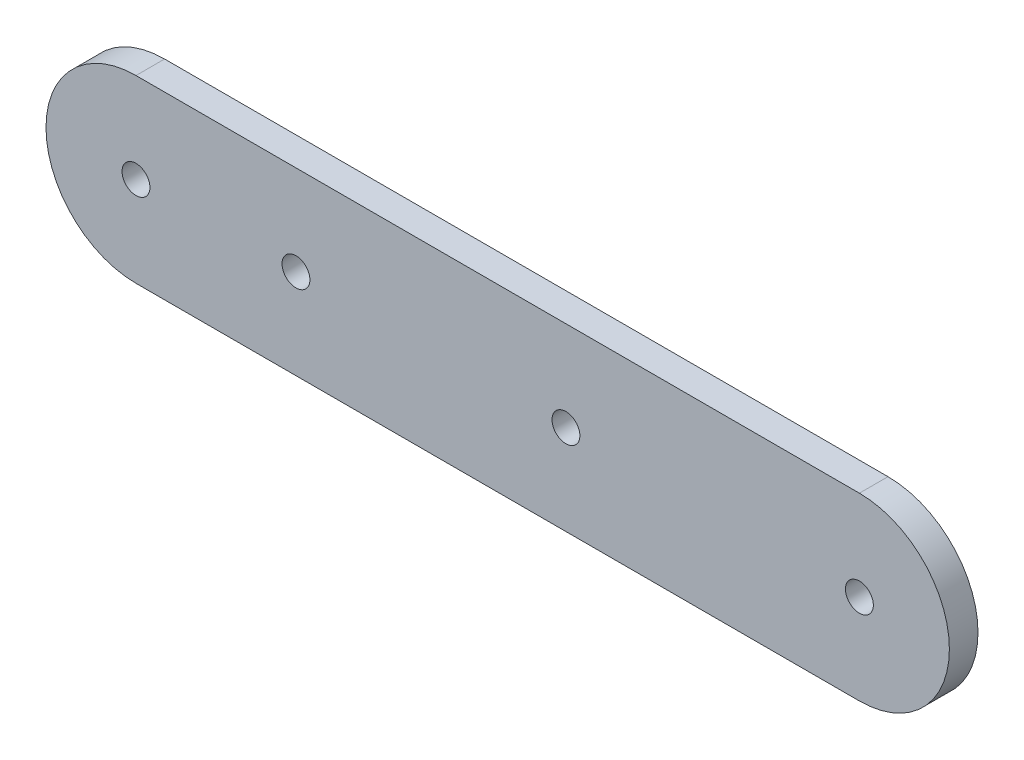
ISO-10303-21;
HEADER;
FILE_DESCRIPTION(('STEP AP214'),'2;1');
FILE_NAME('part.step','',(''),(''),'','','');
FILE_SCHEMA(('AUTOMOTIVE_DESIGN { 1 0 10303 214 1 1 1 1 }'));
ENDSEC;
DATA;
#1=APPLICATION_CONTEXT('core data for automotive mechanical design processes');
#2=APPLICATION_PROTOCOL_DEFINITION('international standard','automotive_design',2000,#1);
#3=PRODUCT_CONTEXT('',#1,'mechanical');
#4=PRODUCT('Part','Part','',(#3));
#5=PRODUCT_RELATED_PRODUCT_CATEGORY('part','',(#4));
#6=PRODUCT_DEFINITION_FORMATION('','',#4);
#7=PRODUCT_DEFINITION_CONTEXT('part definition',#1,'design');
#8=PRODUCT_DEFINITION('design','',#6,#7);
#9=PRODUCT_DEFINITION_SHAPE('','',#8);
#10=(LENGTH_UNIT() NAMED_UNIT(*) SI_UNIT(.MILLI.,.METRE.));
#11=(NAMED_UNIT(*) PLANE_ANGLE_UNIT() SI_UNIT($,.RADIAN.));
#12=(NAMED_UNIT(*) SI_UNIT($,.STERADIAN.) SOLID_ANGLE_UNIT());
#13=UNCERTAINTY_MEASURE_WITH_UNIT(LENGTH_MEASURE(1.E-05),#10,'distance_accuracy_value','');
#14=(GEOMETRIC_REPRESENTATION_CONTEXT(3) GLOBAL_UNCERTAINTY_ASSIGNED_CONTEXT((#13)) GLOBAL_UNIT_ASSIGNED_CONTEXT((#10,
#11,#12)) REPRESENTATION_CONTEXT('',''));
#15=CARTESIAN_POINT('',(0.,0.,0.));
#16=DIRECTION('',(0.,0.,1.));
#17=DIRECTION('',(1.,0.,0.));
#18=AXIS2_PLACEMENT_3D('',#15,#16,#17);
#19=CARTESIAN_POINT('',(-34.9779971813618,0.,1.59));
#20=DIRECTION('',(0.,0.,-1.));
#21=DIRECTION('',(-1.,0.,0.));
#22=AXIS2_PLACEMENT_3D('',#19,#20,#21);
#23=CYLINDRICAL_SURFACE('',#22,10.);
#24=CARTESIAN_POINT('',(-34.9779971813618,0.,-1.59));
#25=DIRECTION('',(0.,0.,1.));
#26=DIRECTION('',(1.,0.,0.));
#27=AXIS2_PLACEMENT_3D('',#24,#25,#26);
#28=CIRCLE('',#27,10.);
#29=CARTESIAN_POINT('',(-34.9779971813618,10.,-1.59));
#30=VERTEX_POINT('',#29);
#31=CARTESIAN_POINT('',(-34.9779971813618,-10.,-1.59));
#32=VERTEX_POINT('',#31);
#33=EDGE_CURVE('E93',#30,#32,#28,.T.);
#34=ORIENTED_EDGE('',*,*,#33,.T.);
#35=DIRECTION('',(0.,0.,-1.));
#36=VECTOR('',#35,1.);
#37=CARTESIAN_POINT('',(-34.9779971813618,-10.,1.59));
#38=LINE('',#37,#36);
#39=CARTESIAN_POINT('',(-34.9779971813618,-10.,1.59));
#40=VERTEX_POINT('',#39);
#41=EDGE_CURVE('E11',#40,#32,#38,.T.);
#42=ORIENTED_EDGE('',*,*,#41,.F.);
#43=CARTESIAN_POINT('',(-34.9779971813618,0.,1.59));
#44=DIRECTION('',(0.,0.,1.));
#45=DIRECTION('',(1.,0.,0.));
#46=AXIS2_PLACEMENT_3D('',#43,#44,#45);
#47=CIRCLE('',#46,10.);
#48=CARTESIAN_POINT('',(-34.9779971813618,10.,1.59));
#49=VERTEX_POINT('',#48);
#50=EDGE_CURVE('E95',#49,#40,#47,.T.);
#51=ORIENTED_EDGE('',*,*,#50,.F.);
#52=DIRECTION('',(0.,0.,-1.));
#53=VECTOR('',#52,1.);
#54=CARTESIAN_POINT('',(-34.9779971813618,10.,1.59));
#55=LINE('',#54,#53);
#56=EDGE_CURVE('E103',#49,#30,#55,.T.);
#57=ORIENTED_EDGE('',*,*,#56,.T.);
#58=EDGE_LOOP('',(#34,#42,#51,#57));
#59=FACE_BOUND('',#58,.T.);
#60=ADVANCED_FACE('F41',(#59),#23,.T.);
#61=CARTESIAN_POINT('',(-34.9779971813618,-10.,1.59));
#62=DIRECTION('',(0.,1.,0.));
#63=DIRECTION('',(0.,0.,1.));
#64=AXIS2_PLACEMENT_3D('',#61,#62,#63);
#65=PLANE('',#64);
#66=DIRECTION('',(1.,0.,0.));
#67=VECTOR('',#66,1.);
#68=CARTESIAN_POINT('',(-34.9779971813618,-10.,-1.59));
#69=LINE('',#68,#67);
#70=CARTESIAN_POINT('',(45.4120028186382,-10.,-1.59));
#71=VERTEX_POINT('',#70);
#72=EDGE_CURVE('E72',#32,#71,#69,.T.);
#73=ORIENTED_EDGE('',*,*,#72,.T.);
#74=DIRECTION('',(0.,0.,-1.));
#75=VECTOR('',#74,1.);
#76=CARTESIAN_POINT('',(45.4120028186382,-10.,1.59));
#77=LINE('',#76,#75);
#78=CARTESIAN_POINT('',(45.4120028186382,-10.,1.59));
#79=VERTEX_POINT('',#78);
#80=EDGE_CURVE('E51',#79,#71,#77,.T.);
#81=ORIENTED_EDGE('',*,*,#80,.F.);
#82=DIRECTION('',(1.,0.,0.));
#83=VECTOR('',#82,1.);
#84=CARTESIAN_POINT('',(-34.9779971813618,-10.,1.59));
#85=LINE('',#84,#83);
#86=EDGE_CURVE('E84',#40,#79,#85,.T.);
#87=ORIENTED_EDGE('',*,*,#86,.F.);
#88=ORIENTED_EDGE('',*,*,#41,.T.);
#89=EDGE_LOOP('',(#73,#81,#87,#88));
#90=FACE_BOUND('',#89,.T.);
#91=ADVANCED_FACE('F165',(#90),#65,.F.);
#92=CARTESIAN_POINT('',(-34.9779971813618,10.,1.59));
#93=DIRECTION('',(0.,-1.,0.));
#94=DIRECTION('',(1.,0.,0.));
#95=AXIS2_PLACEMENT_3D('',#92,#93,#94);
#96=PLANE('',#95);
#97=DIRECTION('',(-1.,0.,0.));
#98=VECTOR('',#97,1.);
#99=CARTESIAN_POINT('',(-34.9779971813618,10.,-1.59));
#100=LINE('',#99,#98);
#101=CARTESIAN_POINT('',(45.4120028186382,10.,-1.59));
#102=VERTEX_POINT('',#101);
#103=EDGE_CURVE('E79',#102,#30,#100,.T.);
#104=ORIENTED_EDGE('',*,*,#103,.T.);
#105=ORIENTED_EDGE('',*,*,#56,.F.);
#106=DIRECTION('',(-1.,0.,0.));
#107=VECTOR('',#106,1.);
#108=CARTESIAN_POINT('',(-34.9779971813618,10.,1.59));
#109=LINE('',#108,#107);
#110=CARTESIAN_POINT('',(45.4120028186382,10.,1.59));
#111=VERTEX_POINT('',#110);
#112=EDGE_CURVE('E59',#111,#49,#109,.T.);
#113=ORIENTED_EDGE('',*,*,#112,.F.);
#114=DIRECTION('',(0.,0.,-1.));
#115=VECTOR('',#114,1.);
#116=CARTESIAN_POINT('',(45.4120028186382,10.,1.59));
#117=LINE('',#116,#115);
#118=EDGE_CURVE('E98',#111,#102,#117,.T.);
#119=ORIENTED_EDGE('',*,*,#118,.T.);
#120=EDGE_LOOP('',(#104,#105,#113,#119));
#121=FACE_BOUND('',#120,.T.);
#122=ADVANCED_FACE('F99',(#121),#96,.F.);
#123=CARTESIAN_POINT('',(-34.9779971813618,0.,1.59));
#124=DIRECTION('',(0.,0.,1.));
#125=DIRECTION('',(1.,0.,0.));
#126=AXIS2_PLACEMENT_3D('',#123,#124,#125);
#127=PLANE('',#126);
#128=CARTESIAN_POINT('',(-34.9779971813618,0.,1.59));
#129=DIRECTION('',(0.,0.,1.));
#130=DIRECTION('',(1.,0.,0.));
#131=AXIS2_PLACEMENT_3D('',#128,#129,#130);
#132=CIRCLE('',#131,1.55);
#133=CARTESIAN_POINT('',(-33.4279971813618,0.,1.59));
#134=VERTEX_POINT('',#133);
#135=EDGE_CURVE('E181',#134,#134,#132,.T.);
#136=ORIENTED_EDGE('',*,*,#135,.F.);
#137=EDGE_LOOP('',(#136));
#138=FACE_BOUND('',#137,.T.);
#139=CARTESIAN_POINT('',(45.4120028186382,0.,1.59));
#140=DIRECTION('',(0.,0.,1.));
#141=DIRECTION('',(1.,0.,0.));
#142=AXIS2_PLACEMENT_3D('',#139,#140,#141);
#143=CIRCLE('',#142,1.55);
#144=CARTESIAN_POINT('',(46.9620028186382,0.,1.59));
#145=VERTEX_POINT('',#144);
#146=EDGE_CURVE('E115',#145,#145,#143,.T.);
#147=ORIENTED_EDGE('',*,*,#146,.F.);
#148=EDGE_LOOP('',(#147));
#149=FACE_BOUND('',#148,.T.);
#150=CARTESIAN_POINT('',(-17.2,0.,1.59));
#151=DIRECTION('',(0.,0.,-1.));
#152=DIRECTION('',(-1.,0.,0.));
#153=AXIS2_PLACEMENT_3D('',#150,#151,#152);
#154=CIRCLE('',#153,1.55);
#155=CARTESIAN_POINT('',(-18.75,0.,1.59));
#156=VERTEX_POINT('',#155);
#157=EDGE_CURVE('E112',#156,#156,#154,.T.);
#158=ORIENTED_EDGE('',*,*,#157,.T.);
#159=EDGE_LOOP('',(#158));
#160=FACE_BOUND('',#159,.T.);
#161=CARTESIAN_POINT('',(12.8,0.,1.59));
#162=DIRECTION('',(0.,0.,-1.));
#163=DIRECTION('',(-1.,0.,0.));
#164=AXIS2_PLACEMENT_3D('',#161,#162,#163);
#165=CIRCLE('',#164,1.55);
#166=CARTESIAN_POINT('',(11.25,0.,1.59));
#167=VERTEX_POINT('',#166);
#168=EDGE_CURVE('E126',#167,#167,#165,.T.);
#169=ORIENTED_EDGE('',*,*,#168,.T.);
#170=EDGE_LOOP('',(#169));
#171=FACE_BOUND('',#170,.T.);
#172=ORIENTED_EDGE('',*,*,#50,.T.);
#173=ORIENTED_EDGE('',*,*,#86,.T.);
#174=CARTESIAN_POINT('',(45.4120028186382,0.,1.59));
#175=DIRECTION('',(0.,0.,1.));
#176=DIRECTION('',(1.,0.,0.));
#177=AXIS2_PLACEMENT_3D('',#174,#175,#176);
#178=CIRCLE('',#177,10.);
#179=EDGE_CURVE('E107',#111,#79,#178,.F.);
#180=ORIENTED_EDGE('',*,*,#179,.F.);
#181=ORIENTED_EDGE('',*,*,#112,.T.);
#182=EDGE_LOOP('',(#172,#173,#180,#181));
#183=FACE_BOUND('',#182,.T.);
#184=ADVANCED_FACE('F159',(#138,#149,#160,#171,#183),#127,.T.);
#185=CARTESIAN_POINT('',(-34.9779971813618,0.,-1.59));
#186=DIRECTION('',(0.,0.,1.));
#187=DIRECTION('',(1.,0.,0.));
#188=AXIS2_PLACEMENT_3D('',#185,#186,#187);
#189=PLANE('',#188);
#190=CARTESIAN_POINT('',(-34.9779971813618,0.,-1.59));
#191=DIRECTION('',(0.,0.,1.));
#192=DIRECTION('',(1.,0.,0.));
#193=AXIS2_PLACEMENT_3D('',#190,#191,#192);
#194=CIRCLE('',#193,1.55);
#195=CARTESIAN_POINT('',(-33.4279971813618,0.,-1.59));
#196=VERTEX_POINT('',#195);
#197=EDGE_CURVE('E192',#196,#196,#194,.T.);
#198=ORIENTED_EDGE('',*,*,#197,.T.);
#199=EDGE_LOOP('',(#198));
#200=FACE_BOUND('',#199,.T.);
#201=CARTESIAN_POINT('',(45.4120028186382,0.,-1.59));
#202=DIRECTION('',(0.,0.,1.));
#203=DIRECTION('',(1.,0.,0.));
#204=AXIS2_PLACEMENT_3D('',#201,#202,#203);
#205=CIRCLE('',#204,1.55);
#206=CARTESIAN_POINT('',(46.9620028186382,0.,-1.59));
#207=VERTEX_POINT('',#206);
#208=EDGE_CURVE('E108',#207,#207,#205,.T.);
#209=ORIENTED_EDGE('',*,*,#208,.T.);
#210=EDGE_LOOP('',(#209));
#211=FACE_BOUND('',#210,.T.);
#212=CARTESIAN_POINT('',(-17.2,0.,-1.59));
#213=DIRECTION('',(0.,0.,1.));
#214=DIRECTION('',(1.,0.,0.));
#215=AXIS2_PLACEMENT_3D('',#212,#213,#214);
#216=CIRCLE('',#215,1.55);
#217=CARTESIAN_POINT('',(-18.75,0.,-1.59));
#218=VERTEX_POINT('',#217);
#219=EDGE_CURVE('E122',#218,#218,#216,.T.);
#220=ORIENTED_EDGE('',*,*,#219,.T.);
#221=EDGE_LOOP('',(#220));
#222=FACE_BOUND('',#221,.T.);
#223=CARTESIAN_POINT('',(12.8,0.,-1.59));
#224=DIRECTION('',(0.,0.,1.));
#225=DIRECTION('',(1.,0.,0.));
#226=AXIS2_PLACEMENT_3D('',#223,#224,#225);
#227=CIRCLE('',#226,1.55);
#228=CARTESIAN_POINT('',(11.25,0.,-1.59));
#229=VERTEX_POINT('',#228);
#230=EDGE_CURVE('E44',#229,#229,#227,.T.);
#231=ORIENTED_EDGE('',*,*,#230,.T.);
#232=EDGE_LOOP('',(#231));
#233=FACE_BOUND('',#232,.T.);
#234=ORIENTED_EDGE('',*,*,#33,.F.);
#235=ORIENTED_EDGE('',*,*,#103,.F.);
#236=CARTESIAN_POINT('',(45.4120028186382,0.,-1.59));
#237=DIRECTION('',(0.,0.,1.));
#238=DIRECTION('',(1.,0.,0.));
#239=AXIS2_PLACEMENT_3D('',#236,#237,#238);
#240=CIRCLE('',#239,10.);
#241=EDGE_CURVE('E91',#102,#71,#240,.F.);
#242=ORIENTED_EDGE('',*,*,#241,.T.);
#243=ORIENTED_EDGE('',*,*,#72,.F.);
#244=EDGE_LOOP('',(#234,#235,#242,#243));
#245=FACE_BOUND('',#244,.T.);
#246=ADVANCED_FACE('F89',(#200,#211,#222,#233,#245),#189,.F.);
#247=CARTESIAN_POINT('',(12.8,0.,1.59));
#248=DIRECTION('',(0.,0.,-1.));
#249=DIRECTION('',(-1.,0.,0.));
#250=AXIS2_PLACEMENT_3D('',#247,#248,#249);
#251=CYLINDRICAL_SURFACE('',#250,1.55);
#252=CARTESIAN_POINT('',(11.25,0.,1.59));
#253=CARTESIAN_POINT('',(11.25,0.,1.556875));
#254=CARTESIAN_POINT('',(11.25,0.,1.52375));
#255=CARTESIAN_POINT('',(11.25,0.,1.4575));
#256=CARTESIAN_POINT('',(11.25,0.,1.424375));
#257=CARTESIAN_POINT('',(11.25,0.,1.358125));
#258=CARTESIAN_POINT('',(11.25,0.,1.325));
#259=CARTESIAN_POINT('',(11.25,0.,1.25875));
#260=CARTESIAN_POINT('',(11.25,0.,1.225625));
#261=CARTESIAN_POINT('',(11.25,0.,1.159375));
#262=CARTESIAN_POINT('',(11.25,0.,1.12625));
#263=CARTESIAN_POINT('',(11.25,0.,1.06));
#264=CARTESIAN_POINT('',(11.25,0.,1.026875));
#265=CARTESIAN_POINT('',(11.25,0.,0.960625));
#266=CARTESIAN_POINT('',(11.25,0.,0.9275));
#267=CARTESIAN_POINT('',(11.25,0.,0.86125));
#268=CARTESIAN_POINT('',(11.25,0.,0.828125));
#269=CARTESIAN_POINT('',(11.25,0.,0.761875));
#270=CARTESIAN_POINT('',(11.25,0.,0.72875));
#271=CARTESIAN_POINT('',(11.25,0.,0.6625));
#272=CARTESIAN_POINT('',(11.25,0.,0.629375));
#273=CARTESIAN_POINT('',(11.25,0.,0.563125));
#274=CARTESIAN_POINT('',(11.25,0.,0.53));
#275=CARTESIAN_POINT('',(11.25,0.,0.46375));
#276=CARTESIAN_POINT('',(11.25,0.,0.430625));
#277=CARTESIAN_POINT('',(11.25,0.,0.364375));
#278=CARTESIAN_POINT('',(11.25,0.,0.33125));
#279=CARTESIAN_POINT('',(11.25,0.,0.265));
#280=CARTESIAN_POINT('',(11.25,0.,0.231875));
#281=CARTESIAN_POINT('',(11.25,0.,0.165625));
#282=CARTESIAN_POINT('',(11.25,0.,0.1325));
#283=CARTESIAN_POINT('',(11.25,0.,0.06625));
#284=CARTESIAN_POINT('',(11.25,0.,0.033125));
#285=CARTESIAN_POINT('',(11.25,0.,-0.033125));
#286=CARTESIAN_POINT('',(11.25,0.,-0.06625));
#287=CARTESIAN_POINT('',(11.25,0.,-0.1325));
#288=CARTESIAN_POINT('',(11.25,0.,-0.165625));
#289=CARTESIAN_POINT('',(11.25,0.,-0.231875));
#290=CARTESIAN_POINT('',(11.25,0.,-0.265));
#291=CARTESIAN_POINT('',(11.25,0.,-0.33125));
#292=CARTESIAN_POINT('',(11.25,0.,-0.364375));
#293=CARTESIAN_POINT('',(11.25,0.,-0.430625));
#294=CARTESIAN_POINT('',(11.25,0.,-0.46375));
#295=CARTESIAN_POINT('',(11.25,0.,-0.53));
#296=CARTESIAN_POINT('',(11.25,0.,-0.563125));
#297=CARTESIAN_POINT('',(11.25,0.,-0.629375));
#298=CARTESIAN_POINT('',(11.25,0.,-0.6625));
#299=CARTESIAN_POINT('',(11.25,0.,-0.72875));
#300=CARTESIAN_POINT('',(11.25,0.,-0.761875));
#301=CARTESIAN_POINT('',(11.25,0.,-0.828125));
#302=CARTESIAN_POINT('',(11.25,0.,-0.86125));
#303=CARTESIAN_POINT('',(11.25,0.,-0.9275));
#304=CARTESIAN_POINT('',(11.25,0.,-0.960625));
#305=CARTESIAN_POINT('',(11.25,0.,-1.026875));
#306=CARTESIAN_POINT('',(11.25,0.,-1.06));
#307=CARTESIAN_POINT('',(11.25,0.,-1.12625));
#308=CARTESIAN_POINT('',(11.25,0.,-1.159375));
#309=CARTESIAN_POINT('',(11.25,0.,-1.225625));
#310=CARTESIAN_POINT('',(11.25,0.,-1.25875));
#311=CARTESIAN_POINT('',(11.25,0.,-1.325));
#312=CARTESIAN_POINT('',(11.25,0.,-1.358125));
#313=CARTESIAN_POINT('',(11.25,0.,-1.424375));
#314=CARTESIAN_POINT('',(11.25,0.,-1.4575));
#315=CARTESIAN_POINT('',(11.25,0.,-1.52375));
#316=CARTESIAN_POINT('',(11.25,0.,-1.556875));
#317=CARTESIAN_POINT('',(11.25,0.,-1.59));
#318=B_SPLINE_CURVE_WITH_KNOTS('',3,(#252,#253,#254,#255,#256,#257,#258,#259,#260,#261,#262,
#263,#264,#265,#266,#267,#268,#269,#270,#271,#272,#273,#274,#275,#276,#277,#278,#279,#280,#281,
#282,#283,#284,#285,#286,#287,#288,#289,#290,#291,#292,#293,#294,#295,#296,#297,#298,#299,#300,
#301,#302,#303,#304,#305,#306,#307,#308,#309,#310,#311,#312,#313,#314,#315,#316,#317),
.UNSPECIFIED.,.F.,.F.,(4,2,2,2,2,2,2,2,2,2,2,2,2,2,2,2,2,2,2,2,2,2,2,2,2,2,2,2,2,2,2,2,4),(0.,
0.0993749999999999,0.19875,0.298125,0.3975,0.496875,0.59625,0.695625,0.795,0.894375,0.99375,
1.093125,1.1925,1.291875,1.39125,1.490625,1.59,1.689375,1.78875,1.888125,1.9875,2.086875,
2.18625,2.285625,2.385,2.484375,2.58375,2.683125,2.7825,2.881875,2.98125,3.080625,3.18),.UNSPECIFIED.);
#319=EDGE_CURVE('BSEAM148',#167,#229,#318,.T.);
#320=ORIENTED_EDGE('',*,*,#168,.F.);
#321=ORIENTED_EDGE('',*,*,#230,.F.);
#322=ORIENTED_EDGE('',*,*,#319,.T.);
#323=ORIENTED_EDGE('',*,*,#319,.F.);
#324=EDGE_LOOP('',(#320,#322,#321,#323));
#325=FACE_BOUND('',#324,.T.);
#326=ADVANCED_FACE('F148',(#325),#251,.F.);
#327=CARTESIAN_POINT('',(-17.2,0.,1.59));
#328=DIRECTION('',(0.,0.,-1.));
#329=DIRECTION('',(-1.,0.,0.));
#330=AXIS2_PLACEMENT_3D('',#327,#328,#329);
#331=CYLINDRICAL_SURFACE('',#330,1.55);
#332=CARTESIAN_POINT('',(-18.75,0.,1.59));
#333=CARTESIAN_POINT('',(-18.75,0.,1.556875));
#334=CARTESIAN_POINT('',(-18.75,0.,1.52375));
#335=CARTESIAN_POINT('',(-18.75,0.,1.4575));
#336=CARTESIAN_POINT('',(-18.75,0.,1.424375));
#337=CARTESIAN_POINT('',(-18.75,0.,1.358125));
#338=CARTESIAN_POINT('',(-18.75,0.,1.325));
#339=CARTESIAN_POINT('',(-18.75,0.,1.25875));
#340=CARTESIAN_POINT('',(-18.75,0.,1.225625));
#341=CARTESIAN_POINT('',(-18.75,0.,1.159375));
#342=CARTESIAN_POINT('',(-18.75,0.,1.12625));
#343=CARTESIAN_POINT('',(-18.75,0.,1.06));
#344=CARTESIAN_POINT('',(-18.75,0.,1.026875));
#345=CARTESIAN_POINT('',(-18.75,0.,0.960625));
#346=CARTESIAN_POINT('',(-18.75,0.,0.9275));
#347=CARTESIAN_POINT('',(-18.75,0.,0.86125));
#348=CARTESIAN_POINT('',(-18.75,0.,0.828125));
#349=CARTESIAN_POINT('',(-18.75,0.,0.761875));
#350=CARTESIAN_POINT('',(-18.75,0.,0.72875));
#351=CARTESIAN_POINT('',(-18.75,0.,0.6625));
#352=CARTESIAN_POINT('',(-18.75,0.,0.629375));
#353=CARTESIAN_POINT('',(-18.75,0.,0.563125));
#354=CARTESIAN_POINT('',(-18.75,0.,0.53));
#355=CARTESIAN_POINT('',(-18.75,0.,0.46375));
#356=CARTESIAN_POINT('',(-18.75,0.,0.430625));
#357=CARTESIAN_POINT('',(-18.75,0.,0.364375));
#358=CARTESIAN_POINT('',(-18.75,0.,0.33125));
#359=CARTESIAN_POINT('',(-18.75,0.,0.265));
#360=CARTESIAN_POINT('',(-18.75,0.,0.231875));
#361=CARTESIAN_POINT('',(-18.75,0.,0.165625));
#362=CARTESIAN_POINT('',(-18.75,0.,0.1325));
#363=CARTESIAN_POINT('',(-18.75,0.,0.06625));
#364=CARTESIAN_POINT('',(-18.75,0.,0.033125));
#365=CARTESIAN_POINT('',(-18.75,0.,-0.033125));
#366=CARTESIAN_POINT('',(-18.75,0.,-0.06625));
#367=CARTESIAN_POINT('',(-18.75,0.,-0.1325));
#368=CARTESIAN_POINT('',(-18.75,0.,-0.165625));
#369=CARTESIAN_POINT('',(-18.75,0.,-0.231875));
#370=CARTESIAN_POINT('',(-18.75,0.,-0.265));
#371=CARTESIAN_POINT('',(-18.75,0.,-0.33125));
#372=CARTESIAN_POINT('',(-18.75,0.,-0.364375));
#373=CARTESIAN_POINT('',(-18.75,0.,-0.430625));
#374=CARTESIAN_POINT('',(-18.75,0.,-0.46375));
#375=CARTESIAN_POINT('',(-18.75,0.,-0.53));
#376=CARTESIAN_POINT('',(-18.75,0.,-0.563125));
#377=CARTESIAN_POINT('',(-18.75,0.,-0.629375));
#378=CARTESIAN_POINT('',(-18.75,0.,-0.6625));
#379=CARTESIAN_POINT('',(-18.75,0.,-0.72875));
#380=CARTESIAN_POINT('',(-18.75,0.,-0.761875));
#381=CARTESIAN_POINT('',(-18.75,0.,-0.828125));
#382=CARTESIAN_POINT('',(-18.75,0.,-0.86125));
#383=CARTESIAN_POINT('',(-18.75,0.,-0.9275));
#384=CARTESIAN_POINT('',(-18.75,0.,-0.960625));
#385=CARTESIAN_POINT('',(-18.75,0.,-1.026875));
#386=CARTESIAN_POINT('',(-18.75,0.,-1.06));
#387=CARTESIAN_POINT('',(-18.75,0.,-1.12625));
#388=CARTESIAN_POINT('',(-18.75,0.,-1.159375));
#389=CARTESIAN_POINT('',(-18.75,0.,-1.225625));
#390=CARTESIAN_POINT('',(-18.75,0.,-1.25875));
#391=CARTESIAN_POINT('',(-18.75,0.,-1.325));
#392=CARTESIAN_POINT('',(-18.75,0.,-1.358125));
#393=CARTESIAN_POINT('',(-18.75,0.,-1.424375));
#394=CARTESIAN_POINT('',(-18.75,0.,-1.4575));
#395=CARTESIAN_POINT('',(-18.75,0.,-1.52375));
#396=CARTESIAN_POINT('',(-18.75,0.,-1.556875));
#397=CARTESIAN_POINT('',(-18.75,0.,-1.59));
#398=B_SPLINE_CURVE_WITH_KNOTS('',3,(#332,#333,#334,#335,#336,#337,#338,#339,#340,#341,#342,
#343,#344,#345,#346,#347,#348,#349,#350,#351,#352,#353,#354,#355,#356,#357,#358,#359,#360,#361,
#362,#363,#364,#365,#366,#367,#368,#369,#370,#371,#372,#373,#374,#375,#376,#377,#378,#379,#380,
#381,#382,#383,#384,#385,#386,#387,#388,#389,#390,#391,#392,#393,#394,#395,#396,#397),
.UNSPECIFIED.,.F.,.F.,(4,2,2,2,2,2,2,2,2,2,2,2,2,2,2,2,2,2,2,2,2,2,2,2,2,2,2,2,2,2,2,2,4),(0.,
0.0993749999999999,0.19875,0.298125,0.3975,0.496875,0.59625,0.695625,0.795,0.894375,0.99375,
1.093125,1.1925,1.291875,1.39125,1.490625,1.59,1.689375,1.78875,1.888125,1.9875,2.086875,
2.18625,2.285625,2.385,2.484375,2.58375,2.683125,2.7825,2.881875,2.98125,3.080625,3.18),.UNSPECIFIED.);
#399=EDGE_CURVE('BSEAM150',#156,#218,#398,.T.);
#400=ORIENTED_EDGE('',*,*,#157,.F.);
#401=ORIENTED_EDGE('',*,*,#219,.F.);
#402=ORIENTED_EDGE('',*,*,#399,.T.);
#403=ORIENTED_EDGE('',*,*,#399,.F.);
#404=EDGE_LOOP('',(#400,#402,#401,#403));
#405=FACE_BOUND('',#404,.T.);
#406=ADVANCED_FACE('F150',(#405),#331,.F.);
#407=CARTESIAN_POINT('',(45.4120028186382,0.,1.59));
#408=DIRECTION('',(0.,0.,-1.));
#409=DIRECTION('',(-1.,0.,0.));
#410=AXIS2_PLACEMENT_3D('',#407,#408,#409);
#411=CYLINDRICAL_SURFACE('',#410,10.);
#412=ORIENTED_EDGE('',*,*,#241,.F.);
#413=ORIENTED_EDGE('',*,*,#118,.F.);
#414=ORIENTED_EDGE('',*,*,#179,.T.);
#415=ORIENTED_EDGE('',*,*,#80,.T.);
#416=EDGE_LOOP('',(#412,#413,#414,#415));
#417=FACE_BOUND('',#416,.T.);
#418=ADVANCED_FACE('F105',(#417),#411,.T.);
#419=CARTESIAN_POINT('',(45.4120028186382,0.,-1.59));
#420=DIRECTION('',(0.,0.,1.));
#421=DIRECTION('',(1.,0.,0.));
#422=AXIS2_PLACEMENT_3D('',#419,#420,#421);
#423=CYLINDRICAL_SURFACE('',#422,1.55);
#424=CARTESIAN_POINT('',(46.9620028186382,0.,-1.59));
#425=CARTESIAN_POINT('',(46.9620028186382,0.,-1.556875));
#426=CARTESIAN_POINT('',(46.9620028186382,0.,-1.52375));
#427=CARTESIAN_POINT('',(46.9620028186382,0.,-1.4575));
#428=CARTESIAN_POINT('',(46.9620028186382,0.,-1.424375));
#429=CARTESIAN_POINT('',(46.9620028186382,0.,-1.358125));
#430=CARTESIAN_POINT('',(46.9620028186382,0.,-1.325));
#431=CARTESIAN_POINT('',(46.9620028186382,0.,-1.25875));
#432=CARTESIAN_POINT('',(46.9620028186382,0.,-1.225625));
#433=CARTESIAN_POINT('',(46.9620028186382,0.,-1.159375));
#434=CARTESIAN_POINT('',(46.9620028186382,0.,-1.12625));
#435=CARTESIAN_POINT('',(46.9620028186382,0.,-1.06));
#436=CARTESIAN_POINT('',(46.9620028186382,0.,-1.026875));
#437=CARTESIAN_POINT('',(46.9620028186382,0.,-0.960625));
#438=CARTESIAN_POINT('',(46.9620028186382,0.,-0.9275));
#439=CARTESIAN_POINT('',(46.9620028186382,0.,-0.86125));
#440=CARTESIAN_POINT('',(46.9620028186382,0.,-0.828125));
#441=CARTESIAN_POINT('',(46.9620028186382,0.,-0.761875));
#442=CARTESIAN_POINT('',(46.9620028186382,0.,-0.72875));
#443=CARTESIAN_POINT('',(46.9620028186382,0.,-0.6625));
#444=CARTESIAN_POINT('',(46.9620028186382,0.,-0.629375));
#445=CARTESIAN_POINT('',(46.9620028186382,0.,-0.563125));
#446=CARTESIAN_POINT('',(46.9620028186382,0.,-0.53));
#447=CARTESIAN_POINT('',(46.9620028186382,0.,-0.46375));
#448=CARTESIAN_POINT('',(46.9620028186382,0.,-0.430625));
#449=CARTESIAN_POINT('',(46.9620028186382,0.,-0.364375));
#450=CARTESIAN_POINT('',(46.9620028186382,0.,-0.33125));
#451=CARTESIAN_POINT('',(46.9620028186382,0.,-0.265));
#452=CARTESIAN_POINT('',(46.9620028186382,0.,-0.231875));
#453=CARTESIAN_POINT('',(46.9620028186382,0.,-0.165625));
#454=CARTESIAN_POINT('',(46.9620028186382,0.,-0.1325));
#455=CARTESIAN_POINT('',(46.9620028186382,0.,-0.06625));
#456=CARTESIAN_POINT('',(46.9620028186382,0.,-0.033125));
#457=CARTESIAN_POINT('',(46.9620028186382,0.,0.033125));
#458=CARTESIAN_POINT('',(46.9620028186382,0.,0.06625));
#459=CARTESIAN_POINT('',(46.9620028186382,0.,0.1325));
#460=CARTESIAN_POINT('',(46.9620028186382,0.,0.165625));
#461=CARTESIAN_POINT('',(46.9620028186382,0.,0.231875));
#462=CARTESIAN_POINT('',(46.9620028186382,0.,0.265));
#463=CARTESIAN_POINT('',(46.9620028186382,0.,0.33125));
#464=CARTESIAN_POINT('',(46.9620028186382,0.,0.364375));
#465=CARTESIAN_POINT('',(46.9620028186382,0.,0.430625));
#466=CARTESIAN_POINT('',(46.9620028186382,0.,0.46375));
#467=CARTESIAN_POINT('',(46.9620028186382,0.,0.53));
#468=CARTESIAN_POINT('',(46.9620028186382,0.,0.563125));
#469=CARTESIAN_POINT('',(46.9620028186382,0.,0.629375));
#470=CARTESIAN_POINT('',(46.9620028186382,0.,0.6625));
#471=CARTESIAN_POINT('',(46.9620028186382,0.,0.72875));
#472=CARTESIAN_POINT('',(46.9620028186382,0.,0.761875));
#473=CARTESIAN_POINT('',(46.9620028186382,0.,0.828125));
#474=CARTESIAN_POINT('',(46.9620028186382,0.,0.86125));
#475=CARTESIAN_POINT('',(46.9620028186382,0.,0.9275));
#476=CARTESIAN_POINT('',(46.9620028186382,0.,0.960625));
#477=CARTESIAN_POINT('',(46.9620028186382,0.,1.026875));
#478=CARTESIAN_POINT('',(46.9620028186382,0.,1.06));
#479=CARTESIAN_POINT('',(46.9620028186382,0.,1.12625));
#480=CARTESIAN_POINT('',(46.9620028186382,0.,1.159375));
#481=CARTESIAN_POINT('',(46.9620028186382,0.,1.225625));
#482=CARTESIAN_POINT('',(46.9620028186382,0.,1.25875));
#483=CARTESIAN_POINT('',(46.9620028186382,0.,1.325));
#484=CARTESIAN_POINT('',(46.9620028186382,0.,1.358125));
#485=CARTESIAN_POINT('',(46.9620028186382,0.,1.424375));
#486=CARTESIAN_POINT('',(46.9620028186382,0.,1.4575));
#487=CARTESIAN_POINT('',(46.9620028186382,0.,1.52375));
#488=CARTESIAN_POINT('',(46.9620028186382,0.,1.556875));
#489=CARTESIAN_POINT('',(46.9620028186382,0.,1.59));
#490=B_SPLINE_CURVE_WITH_KNOTS('',3,(#424,#425,#426,#427,#428,#429,#430,#431,#432,#433,#434,
#435,#436,#437,#438,#439,#440,#441,#442,#443,#444,#445,#446,#447,#448,#449,#450,#451,#452,#453,
#454,#455,#456,#457,#458,#459,#460,#461,#462,#463,#464,#465,#466,#467,#468,#469,#470,#471,#472,
#473,#474,#475,#476,#477,#478,#479,#480,#481,#482,#483,#484,#485,#486,#487,#488,#489),
.UNSPECIFIED.,.F.,.F.,(4,2,2,2,2,2,2,2,2,2,2,2,2,2,2,2,2,2,2,2,2,2,2,2,2,2,2,2,2,2,2,2,4),(0.,
0.0993749999999999,0.19875,0.298125,0.3975,0.496875,0.59625,0.695625,0.795,0.894375,0.99375,
1.093125,1.1925,1.291875,1.39125,1.490625,1.59,1.689375,1.78875,1.888125,1.9875,2.086875,
2.18625,2.285625,2.385,2.484375,2.58375,2.683125,2.7825,2.881875,2.98125,3.080625,3.18),.UNSPECIFIED.);
#491=EDGE_CURVE('BSEAM201',#207,#145,#490,.T.);
#492=ORIENTED_EDGE('',*,*,#208,.F.);
#493=ORIENTED_EDGE('',*,*,#146,.T.);
#494=ORIENTED_EDGE('',*,*,#491,.T.);
#495=ORIENTED_EDGE('',*,*,#491,.F.);
#496=EDGE_LOOP('',(#492,#494,#493,#495));
#497=FACE_BOUND('',#496,.T.);
#498=ADVANCED_FACE('F201',(#497),#423,.F.);
#499=CARTESIAN_POINT('',(-34.9779971813618,0.,-1.59));
#500=DIRECTION('',(0.,0.,1.));
#501=DIRECTION('',(1.,0.,0.));
#502=AXIS2_PLACEMENT_3D('',#499,#500,#501);
#503=CYLINDRICAL_SURFACE('',#502,1.55);
#504=CARTESIAN_POINT('',(-33.4279971813618,0.,-1.59));
#505=CARTESIAN_POINT('',(-33.4279971813618,0.,-1.556875));
#506=CARTESIAN_POINT('',(-33.4279971813618,0.,-1.52375));
#507=CARTESIAN_POINT('',(-33.4279971813618,0.,-1.4575));
#508=CARTESIAN_POINT('',(-33.4279971813618,0.,-1.424375));
#509=CARTESIAN_POINT('',(-33.4279971813618,0.,-1.358125));
#510=CARTESIAN_POINT('',(-33.4279971813618,0.,-1.325));
#511=CARTESIAN_POINT('',(-33.4279971813618,0.,-1.25875));
#512=CARTESIAN_POINT('',(-33.4279971813618,0.,-1.225625));
#513=CARTESIAN_POINT('',(-33.4279971813618,0.,-1.159375));
#514=CARTESIAN_POINT('',(-33.4279971813618,0.,-1.12625));
#515=CARTESIAN_POINT('',(-33.4279971813618,0.,-1.06));
#516=CARTESIAN_POINT('',(-33.4279971813618,0.,-1.026875));
#517=CARTESIAN_POINT('',(-33.4279971813618,0.,-0.960625));
#518=CARTESIAN_POINT('',(-33.4279971813618,0.,-0.9275));
#519=CARTESIAN_POINT('',(-33.4279971813618,0.,-0.86125));
#520=CARTESIAN_POINT('',(-33.4279971813618,0.,-0.828125));
#521=CARTESIAN_POINT('',(-33.4279971813618,0.,-0.761875));
#522=CARTESIAN_POINT('',(-33.4279971813618,0.,-0.72875));
#523=CARTESIAN_POINT('',(-33.4279971813618,0.,-0.6625));
#524=CARTESIAN_POINT('',(-33.4279971813618,0.,-0.629375));
#525=CARTESIAN_POINT('',(-33.4279971813618,0.,-0.563125));
#526=CARTESIAN_POINT('',(-33.4279971813618,0.,-0.53));
#527=CARTESIAN_POINT('',(-33.4279971813618,0.,-0.46375));
#528=CARTESIAN_POINT('',(-33.4279971813618,0.,-0.430625));
#529=CARTESIAN_POINT('',(-33.4279971813618,0.,-0.364375));
#530=CARTESIAN_POINT('',(-33.4279971813618,0.,-0.33125));
#531=CARTESIAN_POINT('',(-33.4279971813618,0.,-0.265));
#532=CARTESIAN_POINT('',(-33.4279971813618,0.,-0.231875));
#533=CARTESIAN_POINT('',(-33.4279971813618,0.,-0.165625));
#534=CARTESIAN_POINT('',(-33.4279971813618,0.,-0.1325));
#535=CARTESIAN_POINT('',(-33.4279971813618,0.,-0.06625));
#536=CARTESIAN_POINT('',(-33.4279971813618,0.,-0.033125));
#537=CARTESIAN_POINT('',(-33.4279971813618,0.,0.033125));
#538=CARTESIAN_POINT('',(-33.4279971813618,0.,0.06625));
#539=CARTESIAN_POINT('',(-33.4279971813618,0.,0.1325));
#540=CARTESIAN_POINT('',(-33.4279971813618,0.,0.165625));
#541=CARTESIAN_POINT('',(-33.4279971813618,0.,0.231875));
#542=CARTESIAN_POINT('',(-33.4279971813618,0.,0.265));
#543=CARTESIAN_POINT('',(-33.4279971813618,0.,0.33125));
#544=CARTESIAN_POINT('',(-33.4279971813618,0.,0.364375));
#545=CARTESIAN_POINT('',(-33.4279971813618,0.,0.430625));
#546=CARTESIAN_POINT('',(-33.4279971813618,0.,0.46375));
#547=CARTESIAN_POINT('',(-33.4279971813618,0.,0.53));
#548=CARTESIAN_POINT('',(-33.4279971813618,0.,0.563125));
#549=CARTESIAN_POINT('',(-33.4279971813618,0.,0.629375));
#550=CARTESIAN_POINT('',(-33.4279971813618,0.,0.6625));
#551=CARTESIAN_POINT('',(-33.4279971813618,0.,0.72875));
#552=CARTESIAN_POINT('',(-33.4279971813618,0.,0.761875));
#553=CARTESIAN_POINT('',(-33.4279971813618,0.,0.828125));
#554=CARTESIAN_POINT('',(-33.4279971813618,0.,0.86125));
#555=CARTESIAN_POINT('',(-33.4279971813618,0.,0.9275));
#556=CARTESIAN_POINT('',(-33.4279971813618,0.,0.960625));
#557=CARTESIAN_POINT('',(-33.4279971813618,0.,1.026875));
#558=CARTESIAN_POINT('',(-33.4279971813618,0.,1.06));
#559=CARTESIAN_POINT('',(-33.4279971813618,0.,1.12625));
#560=CARTESIAN_POINT('',(-33.4279971813618,0.,1.159375));
#561=CARTESIAN_POINT('',(-33.4279971813618,0.,1.225625));
#562=CARTESIAN_POINT('',(-33.4279971813618,0.,1.25875));
#563=CARTESIAN_POINT('',(-33.4279971813618,0.,1.325));
#564=CARTESIAN_POINT('',(-33.4279971813618,0.,1.358125));
#565=CARTESIAN_POINT('',(-33.4279971813618,0.,1.424375));
#566=CARTESIAN_POINT('',(-33.4279971813618,0.,1.4575));
#567=CARTESIAN_POINT('',(-33.4279971813618,0.,1.52375));
#568=CARTESIAN_POINT('',(-33.4279971813618,0.,1.556875));
#569=CARTESIAN_POINT('',(-33.4279971813618,0.,1.59));
#570=B_SPLINE_CURVE_WITH_KNOTS('',3,(#504,#505,#506,#507,#508,#509,#510,#511,#512,#513,#514,
#515,#516,#517,#518,#519,#520,#521,#522,#523,#524,#525,#526,#527,#528,#529,#530,#531,#532,#533,
#534,#535,#536,#537,#538,#539,#540,#541,#542,#543,#544,#545,#546,#547,#548,#549,#550,#551,#552,
#553,#554,#555,#556,#557,#558,#559,#560,#561,#562,#563,#564,#565,#566,#567,#568,#569),
.UNSPECIFIED.,.F.,.F.,(4,2,2,2,2,2,2,2,2,2,2,2,2,2,2,2,2,2,2,2,2,2,2,2,2,2,2,2,2,2,2,2,4),(0.,
0.0993749999999999,0.19875,0.298125,0.3975,0.496875,0.59625,0.695625,0.795,0.894375,0.99375,
1.093125,1.1925,1.291875,1.39125,1.490625,1.59,1.689375,1.78875,1.888125,1.9875,2.086875,
2.18625,2.285625,2.385,2.484375,2.58375,2.683125,2.7825,2.881875,2.98125,3.080625,3.18),.UNSPECIFIED.);
#571=EDGE_CURVE('BSEAM199',#196,#134,#570,.T.);
#572=ORIENTED_EDGE('',*,*,#197,.F.);
#573=ORIENTED_EDGE('',*,*,#135,.T.);
#574=ORIENTED_EDGE('',*,*,#571,.T.);
#575=ORIENTED_EDGE('',*,*,#571,.F.);
#576=EDGE_LOOP('',(#572,#574,#573,#575));
#577=FACE_BOUND('',#576,.T.);
#578=ADVANCED_FACE('F199',(#577),#503,.F.);
#579=CLOSED_SHELL('',(#60,#91,#122,#184,#246,#326,#406,#418,#498,#578));
#580=MANIFOLD_SOLID_BREP('B2',#579);
#581=ADVANCED_BREP_SHAPE_REPRESENTATION('',(#18,#580),#14);
#582=SHAPE_DEFINITION_REPRESENTATION(#9,#581);
ENDSEC;
END-ISO-10303-21;
